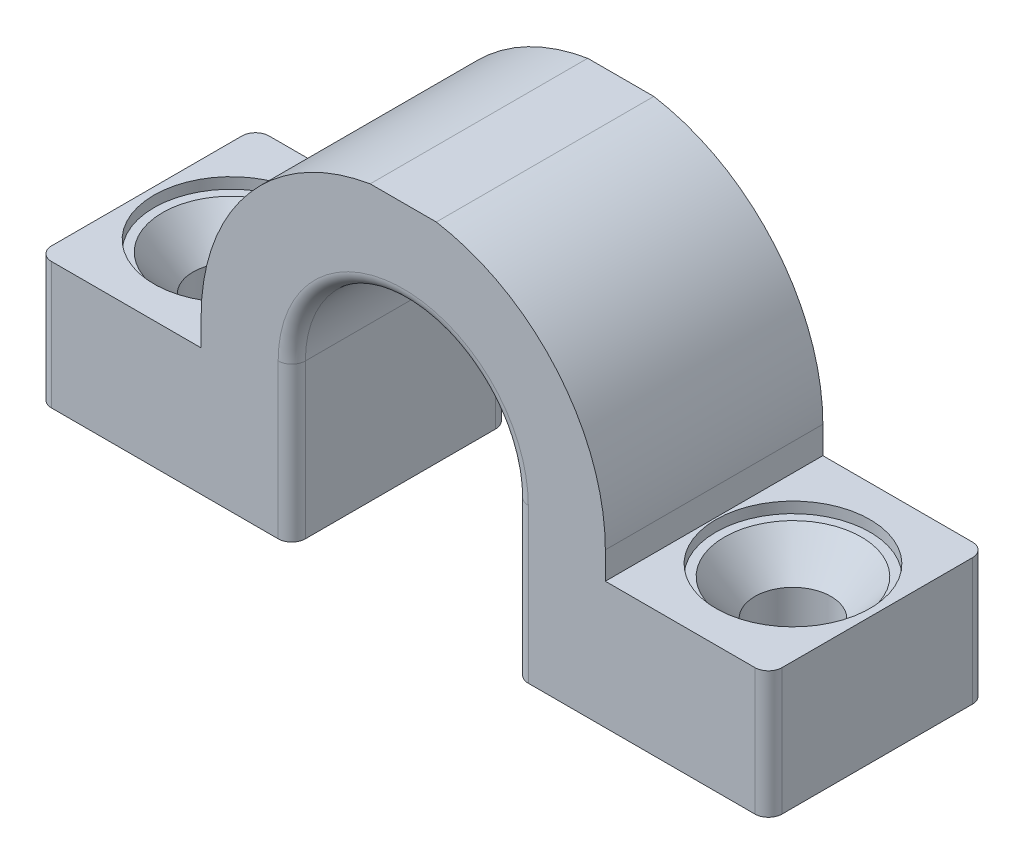
ISO-10303-21;
HEADER;
FILE_DESCRIPTION(('STEP AP214'),'2;1');
FILE_NAME('part.step','',(''),(''),'','','');
FILE_SCHEMA(('AUTOMOTIVE_DESIGN { 1 0 10303 214 1 1 1 1 }'));
ENDSEC;
DATA;
#1=APPLICATION_CONTEXT('core data for automotive mechanical design processes');
#2=APPLICATION_PROTOCOL_DEFINITION('international standard','automotive_design',2000,#1);
#3=PRODUCT_CONTEXT('',#1,'mechanical');
#4=PRODUCT('Part','Part','',(#3));
#5=PRODUCT_RELATED_PRODUCT_CATEGORY('part','',(#4));
#6=PRODUCT_DEFINITION_FORMATION('','',#4);
#7=PRODUCT_DEFINITION_CONTEXT('part definition',#1,'design');
#8=PRODUCT_DEFINITION('design','',#6,#7);
#9=PRODUCT_DEFINITION_SHAPE('','',#8);
#10=(LENGTH_UNIT() NAMED_UNIT(*) SI_UNIT(.MILLI.,.METRE.));
#11=(NAMED_UNIT(*) PLANE_ANGLE_UNIT() SI_UNIT($,.RADIAN.));
#12=(NAMED_UNIT(*) SI_UNIT($,.STERADIAN.) SOLID_ANGLE_UNIT());
#13=UNCERTAINTY_MEASURE_WITH_UNIT(LENGTH_MEASURE(1.E-05),#10,'distance_accuracy_value','');
#14=(GEOMETRIC_REPRESENTATION_CONTEXT(3) GLOBAL_UNCERTAINTY_ASSIGNED_CONTEXT((#13)) GLOBAL_UNIT_ASSIGNED_CONTEXT((#10,
#11,#12)) REPRESENTATION_CONTEXT('',''));
#15=CARTESIAN_POINT('',(0.,0.,0.));
#16=DIRECTION('',(0.,0.,1.));
#17=DIRECTION('',(1.,0.,0.));
#18=AXIS2_PLACEMENT_3D('',#15,#16,#17);
#19=CARTESIAN_POINT('',(15.5,-8.5,6.));
#20=DIRECTION('',(0.,1.,0.));
#21=DIRECTION('',(-1.,0.,0.));
#22=AXIS2_PLACEMENT_3D('',#19,#20,#21);
#23=CYLINDRICAL_SURFACE('',#22,2.1);
#24=CARTESIAN_POINT('',(15.5,-4.10000000000001,6.));
#25=DIRECTION('',(0.,1.,0.));
#26=DIRECTION('',(0.,0.,1.));
#27=AXIS2_PLACEMENT_3D('',#24,#25,#26);
#28=CIRCLE('',#27,2.1);
#29=CARTESIAN_POINT('',(15.5,-4.10000000000001,8.1));
#30=VERTEX_POINT('',#29);
#31=EDGE_CURVE('E352',#30,#30,#28,.T.);
#32=ORIENTED_EDGE('',*,*,#31,.T.);
#33=EDGE_LOOP('',(#32));
#34=FACE_BOUND('',#33,.T.);
#35=CARTESIAN_POINT('',(15.5,-8.5,6.));
#36=DIRECTION('',(0.,1.,0.));
#37=DIRECTION('',(-1.,0.,0.));
#38=AXIS2_PLACEMENT_3D('',#35,#36,#37);
#39=CIRCLE('',#38,2.1);
#40=CARTESIAN_POINT('',(13.4,-8.5,6.));
#41=VERTEX_POINT('',#40);
#42=EDGE_CURVE('E219',#41,#41,#39,.T.);
#43=ORIENTED_EDGE('',*,*,#42,.F.);
#44=EDGE_LOOP('',(#43));
#45=FACE_BOUND('',#44,.T.);
#46=ADVANCED_FACE('F37',(#34,#45),#23,.F.);
#47=CARTESIAN_POINT('',(-15.5,-8.5,6.));
#48=DIRECTION('',(0.,1.,0.));
#49=DIRECTION('',(-1.,0.,0.));
#50=AXIS2_PLACEMENT_3D('',#47,#48,#49);
#51=CYLINDRICAL_SURFACE('',#50,2.1);
#52=CARTESIAN_POINT('',(-15.5,-4.1,6.));
#53=DIRECTION('',(0.,1.,0.));
#54=DIRECTION('',(0.,0.,1.));
#55=AXIS2_PLACEMENT_3D('',#52,#53,#54);
#56=CIRCLE('',#55,2.1);
#57=CARTESIAN_POINT('',(-15.5,-4.1,8.1));
#58=VERTEX_POINT('',#57);
#59=EDGE_CURVE('E11',#58,#58,#56,.T.);
#60=ORIENTED_EDGE('',*,*,#59,.T.);
#61=EDGE_LOOP('',(#60));
#62=FACE_BOUND('',#61,.T.);
#63=CARTESIAN_POINT('',(-15.5,-8.5,6.));
#64=DIRECTION('',(0.,1.,0.));
#65=DIRECTION('',(-1.,0.,0.));
#66=AXIS2_PLACEMENT_3D('',#63,#64,#65);
#67=CIRCLE('',#66,2.1);
#68=CARTESIAN_POINT('',(-17.6,-8.5,6.));
#69=VERTEX_POINT('',#68);
#70=EDGE_CURVE('E216',#69,#69,#67,.T.);
#71=ORIENTED_EDGE('',*,*,#70,.F.);
#72=EDGE_LOOP('',(#71));
#73=FACE_BOUND('',#72,.T.);
#74=ADVANCED_FACE('F370',(#62,#73),#51,.F.);
#75=CARTESIAN_POINT('',(0.,0.,12.));
#76=DIRECTION('',(0.,0.,-1.));
#77=DIRECTION('',(-1.,0.,0.));
#78=AXIS2_PLACEMENT_3D('',#75,#76,#77);
#79=CYLINDRICAL_SURFACE('',#78,11.15);
#80=DIRECTION('',(0.,0.,-1.));
#81=VECTOR('',#80,1.);
#82=CARTESIAN_POINT('',(1.82277261335583,11.,12.));
#83=LINE('',#82,#81);
#84=CARTESIAN_POINT('',(1.82277261335583,11.,12.));
#85=VERTEX_POINT('',#84);
#86=CARTESIAN_POINT('',(1.82277261335583,11.,0.));
#87=VERTEX_POINT('',#86);
#88=EDGE_CURVE('E194',#85,#87,#83,.T.);
#89=ORIENTED_EDGE('',*,*,#88,.F.);
#90=CARTESIAN_POINT('',(0.,0.,12.));
#91=DIRECTION('',(0.,0.,1.));
#92=DIRECTION('',(1.,0.,0.));
#93=AXIS2_PLACEMENT_3D('',#90,#91,#92);
#94=CIRCLE('',#93,11.15);
#95=CARTESIAN_POINT('',(11.15,0.,12.));
#96=VERTEX_POINT('',#95);
#97=EDGE_CURVE('E497',#96,#85,#94,.T.);
#98=ORIENTED_EDGE('',*,*,#97,.F.);
#99=DIRECTION('',(0.,0.,-1.));
#100=VECTOR('',#99,1.);
#101=CARTESIAN_POINT('',(11.15,0.,12.));
#102=LINE('',#101,#100);
#103=CARTESIAN_POINT('',(11.15,0.,0.));
#104=VERTEX_POINT('',#103);
#105=EDGE_CURVE('E238',#96,#104,#102,.T.);
#106=ORIENTED_EDGE('',*,*,#105,.T.);
#107=CARTESIAN_POINT('',(0.,0.,0.));
#108=DIRECTION('',(0.,0.,1.));
#109=DIRECTION('',(1.,0.,0.));
#110=AXIS2_PLACEMENT_3D('',#107,#108,#109);
#111=CIRCLE('',#110,11.15);
#112=EDGE_CURVE('E215',#104,#87,#111,.T.);
#113=ORIENTED_EDGE('',*,*,#112,.T.);
#114=EDGE_LOOP('',(#89,#98,#106,#113));
#115=FACE_BOUND('',#114,.T.);
#116=ADVANCED_FACE('F376',(#115),#79,.T.);
#117=DIRECTION('',(0.,0.,-1.));
#118=VECTOR('',#117,1.);
#119=CARTESIAN_POINT('',(-1.82277261335583,11.,12.));
#120=LINE('',#119,#118);
#121=CARTESIAN_POINT('',(-1.82277261335583,11.,0.));
#122=VERTEX_POINT('',#121);
#123=CARTESIAN_POINT('',(-1.82277261335583,11.,12.));
#124=VERTEX_POINT('',#123);
#125=EDGE_CURVE('E191',#122,#124,#120,.F.);
#126=ORIENTED_EDGE('',*,*,#125,.F.);
#127=CARTESIAN_POINT('',(-11.15,0.,0.));
#128=VERTEX_POINT('',#127);
#129=EDGE_CURVE('E206',#122,#128,#111,.T.);
#130=ORIENTED_EDGE('',*,*,#129,.T.);
#131=DIRECTION('',(0.,0.,-1.));
#132=VECTOR('',#131,1.);
#133=CARTESIAN_POINT('',(-11.15,0.,12.));
#134=LINE('',#133,#132);
#135=CARTESIAN_POINT('',(-11.15,0.,12.));
#136=VERTEX_POINT('',#135);
#137=EDGE_CURVE('E200',#136,#128,#134,.T.);
#138=ORIENTED_EDGE('',*,*,#137,.F.);
#139=EDGE_CURVE('E208',#124,#136,#94,.T.);
#140=ORIENTED_EDGE('',*,*,#139,.F.);
#141=EDGE_LOOP('',(#126,#130,#138,#140));
#142=FACE_BOUND('',#141,.T.);
#143=ADVANCED_FACE('F204',(#142),#79,.T.);
#144=CARTESIAN_POINT('',(0.,0.,12.));
#145=DIRECTION('',(0.,0.,1.));
#146=DIRECTION('',(1.,0.,0.));
#147=AXIS2_PLACEMENT_3D('',#144,#145,#146);
#148=PLANE('',#147);
#149=CARTESIAN_POINT('',(0.,0.,12.));
#150=DIRECTION('',(0.,0.,1.));
#151=DIRECTION('',(1.,0.,0.));
#152=AXIS2_PLACEMENT_3D('',#149,#150,#151);
#153=CIRCLE('',#152,6.9);
#154=CARTESIAN_POINT('',(-6.9,0.,12.));
#155=VERTEX_POINT('',#154);
#156=CARTESIAN_POINT('',(6.9,0.,12.));
#157=VERTEX_POINT('',#156);
#158=EDGE_CURVE('E305',#155,#157,#153,.F.);
#159=ORIENTED_EDGE('',*,*,#158,.T.);
#160=DIRECTION('',(0.,-1.,0.));
#161=VECTOR('',#160,1.);
#162=CARTESIAN_POINT('',(6.9,-8.5,12.));
#163=LINE('',#162,#161);
#164=CARTESIAN_POINT('',(6.9,-8.5,12.));
#165=VERTEX_POINT('',#164);
#166=EDGE_CURVE('E307',#157,#165,#163,.T.);
#167=ORIENTED_EDGE('',*,*,#166,.T.);
#168=DIRECTION('',(1.,0.,0.));
#169=VECTOR('',#168,1.);
#170=CARTESIAN_POINT('',(6.15,-8.5,12.));
#171=LINE('',#170,#169);
#172=CARTESIAN_POINT('',(19.4,-8.5,12.));
#173=VERTEX_POINT('',#172);
#174=EDGE_CURVE('E495',#165,#173,#171,.T.);
#175=ORIENTED_EDGE('',*,*,#174,.T.);
#176=DIRECTION('',(0.,1.,0.));
#177=VECTOR('',#176,1.);
#178=CARTESIAN_POINT('',(19.4,-1.5,12.));
#179=LINE('',#178,#177);
#180=CARTESIAN_POINT('',(19.4,-1.5,12.));
#181=VERTEX_POINT('',#180);
#182=EDGE_CURVE('E300',#173,#181,#179,.T.);
#183=ORIENTED_EDGE('',*,*,#182,.T.);
#184=DIRECTION('',(-1.,0.,0.));
#185=VECTOR('',#184,1.);
#186=CARTESIAN_POINT('',(20.15,-1.5,12.));
#187=LINE('',#186,#185);
#188=CARTESIAN_POINT('',(11.15,-1.5,12.));
#189=VERTEX_POINT('',#188);
#190=EDGE_CURVE('E502',#181,#189,#187,.T.);
#191=ORIENTED_EDGE('',*,*,#190,.T.);
#192=DIRECTION('',(0.,1.,0.));
#193=VECTOR('',#192,1.);
#194=CARTESIAN_POINT('',(11.15,-1.5,12.));
#195=LINE('',#194,#193);
#196=EDGE_CURVE('E223',#189,#96,#195,.T.);
#197=ORIENTED_EDGE('',*,*,#196,.T.);
#198=ORIENTED_EDGE('',*,*,#97,.T.);
#199=DIRECTION('',(-1.,0.,0.));
#200=VECTOR('',#199,1.);
#201=CARTESIAN_POINT('',(0.,11.,12.));
#202=LINE('',#201,#200);
#203=EDGE_CURVE('E512',#85,#124,#202,.T.);
#204=ORIENTED_EDGE('',*,*,#203,.T.);
#205=ORIENTED_EDGE('',*,*,#139,.T.);
#206=DIRECTION('',(0.,-1.,0.));
#207=VECTOR('',#206,1.);
#208=CARTESIAN_POINT('',(-11.15,0.,12.));
#209=LINE('',#208,#207);
#210=CARTESIAN_POINT('',(-11.15,-1.5,12.));
#211=VERTEX_POINT('',#210);
#212=EDGE_CURVE('E491',#136,#211,#209,.T.);
#213=ORIENTED_EDGE('',*,*,#212,.T.);
#214=DIRECTION('',(-1.,0.,0.));
#215=VECTOR('',#214,1.);
#216=CARTESIAN_POINT('',(-11.15,-1.5,12.));
#217=LINE('',#216,#215);
#218=CARTESIAN_POINT('',(-19.4,-1.5,12.));
#219=VERTEX_POINT('',#218);
#220=EDGE_CURVE('E487',#211,#219,#217,.T.);
#221=ORIENTED_EDGE('',*,*,#220,.T.);
#222=DIRECTION('',(0.,-1.,0.));
#223=VECTOR('',#222,1.);
#224=CARTESIAN_POINT('',(-19.4,-8.5,12.));
#225=LINE('',#224,#223);
#226=CARTESIAN_POINT('',(-19.4,-8.5,12.));
#227=VERTEX_POINT('',#226);
#228=EDGE_CURVE('E297',#219,#227,#225,.T.);
#229=ORIENTED_EDGE('',*,*,#228,.T.);
#230=DIRECTION('',(1.,0.,0.));
#231=VECTOR('',#230,1.);
#232=CARTESIAN_POINT('',(-20.15,-8.5,12.));
#233=LINE('',#232,#231);
#234=CARTESIAN_POINT('',(-6.9,-8.5,12.));
#235=VERTEX_POINT('',#234);
#236=EDGE_CURVE('E493',#227,#235,#233,.T.);
#237=ORIENTED_EDGE('',*,*,#236,.T.);
#238=DIRECTION('',(0.,1.,0.));
#239=VECTOR('',#238,1.);
#240=CARTESIAN_POINT('',(-6.9,0.,12.));
#241=LINE('',#240,#239);
#242=EDGE_CURVE('E303',#235,#155,#241,.T.);
#243=ORIENTED_EDGE('',*,*,#242,.T.);
#244=EDGE_LOOP('',(#159,#167,#175,#183,#191,#197,#198,#204,#205,#213,#221,#229,#237,#243));
#245=FACE_BOUND('',#244,.T.);
#246=ADVANCED_FACE('F382',(#245),#148,.T.);
#247=CARTESIAN_POINT('',(0.,0.,0.));
#248=DIRECTION('',(0.,0.,1.));
#249=DIRECTION('',(1.,0.,0.));
#250=AXIS2_PLACEMENT_3D('',#247,#248,#249);
#251=PLANE('',#250);
#252=CARTESIAN_POINT('',(0.,0.,0.));
#253=DIRECTION('',(0.,0.,1.));
#254=DIRECTION('',(1.,0.,0.));
#255=AXIS2_PLACEMENT_3D('',#252,#253,#254);
#256=CIRCLE('',#255,6.9);
#257=CARTESIAN_POINT('',(6.9,0.,0.));
#258=VERTEX_POINT('',#257);
#259=CARTESIAN_POINT('',(-6.9,0.,0.));
#260=VERTEX_POINT('',#259);
#261=EDGE_CURVE('E281',#258,#260,#256,.T.);
#262=ORIENTED_EDGE('',*,*,#261,.T.);
#263=DIRECTION('',(0.,1.,0.));
#264=VECTOR('',#263,1.);
#265=CARTESIAN_POINT('',(-6.9,0.,0.));
#266=LINE('',#265,#264);
#267=CARTESIAN_POINT('',(-6.9,-8.5,0.));
#268=VERTEX_POINT('',#267);
#269=EDGE_CURVE('E283',#260,#268,#266,.F.);
#270=ORIENTED_EDGE('',*,*,#269,.T.);
#271=DIRECTION('',(1.,0.,0.));
#272=VECTOR('',#271,1.);
#273=CARTESIAN_POINT('',(-20.15,-8.5,0.));
#274=LINE('',#273,#272);
#275=CARTESIAN_POINT('',(-19.4,-8.5,0.));
#276=VERTEX_POINT('',#275);
#277=EDGE_CURVE('E228',#276,#268,#274,.T.);
#278=ORIENTED_EDGE('',*,*,#277,.F.);
#279=DIRECTION('',(0.,-1.,0.));
#280=VECTOR('',#279,1.);
#281=CARTESIAN_POINT('',(-19.4,0.,0.));
#282=LINE('',#281,#280);
#283=CARTESIAN_POINT('',(-19.4,-1.5,0.));
#284=VERTEX_POINT('',#283);
#285=EDGE_CURVE('E275',#276,#284,#282,.F.);
#286=ORIENTED_EDGE('',*,*,#285,.T.);
#287=DIRECTION('',(-1.,0.,0.));
#288=VECTOR('',#287,1.);
#289=CARTESIAN_POINT('',(-11.15,-1.5,0.));
#290=LINE('',#289,#288);
#291=CARTESIAN_POINT('',(-11.15,-1.5,0.));
#292=VERTEX_POINT('',#291);
#293=EDGE_CURVE('E226',#292,#284,#290,.T.);
#294=ORIENTED_EDGE('',*,*,#293,.F.);
#295=DIRECTION('',(0.,-1.,0.));
#296=VECTOR('',#295,1.);
#297=CARTESIAN_POINT('',(-11.15,0.,0.));
#298=LINE('',#297,#296);
#299=EDGE_CURVE('E213',#128,#292,#298,.T.);
#300=ORIENTED_EDGE('',*,*,#299,.F.);
#301=ORIENTED_EDGE('',*,*,#129,.F.);
#302=DIRECTION('',(-1.,0.,0.));
#303=VECTOR('',#302,1.);
#304=CARTESIAN_POINT('',(0.,11.,0.));
#305=LINE('',#304,#303);
#306=EDGE_CURVE('E188',#87,#122,#305,.T.);
#307=ORIENTED_EDGE('',*,*,#306,.F.);
#308=ORIENTED_EDGE('',*,*,#112,.F.);
#309=DIRECTION('',(0.,1.,0.));
#310=VECTOR('',#309,1.);
#311=CARTESIAN_POINT('',(11.15,-1.5,0.));
#312=LINE('',#311,#310);
#313=CARTESIAN_POINT('',(11.15,-1.5,0.));
#314=VERTEX_POINT('',#313);
#315=EDGE_CURVE('E236',#314,#104,#312,.T.);
#316=ORIENTED_EDGE('',*,*,#315,.F.);
#317=DIRECTION('',(-1.,0.,0.));
#318=VECTOR('',#317,1.);
#319=CARTESIAN_POINT('',(20.15,-1.5,0.));
#320=LINE('',#319,#318);
#321=CARTESIAN_POINT('',(19.4,-1.5,0.));
#322=VERTEX_POINT('',#321);
#323=EDGE_CURVE('E234',#322,#314,#320,.T.);
#324=ORIENTED_EDGE('',*,*,#323,.F.);
#325=DIRECTION('',(0.,1.,0.));
#326=VECTOR('',#325,1.);
#327=CARTESIAN_POINT('',(19.4,0.,0.));
#328=LINE('',#327,#326);
#329=CARTESIAN_POINT('',(19.4,-8.5,0.));
#330=VERTEX_POINT('',#329);
#331=EDGE_CURVE('E277',#322,#330,#328,.F.);
#332=ORIENTED_EDGE('',*,*,#331,.T.);
#333=DIRECTION('',(1.,0.,0.));
#334=VECTOR('',#333,1.);
#335=CARTESIAN_POINT('',(6.15,-8.5,0.));
#336=LINE('',#335,#334);
#337=CARTESIAN_POINT('',(6.9,-8.5,0.));
#338=VERTEX_POINT('',#337);
#339=EDGE_CURVE('E231',#338,#330,#336,.T.);
#340=ORIENTED_EDGE('',*,*,#339,.F.);
#341=DIRECTION('',(0.,-1.,0.));
#342=VECTOR('',#341,1.);
#343=CARTESIAN_POINT('',(6.9,0.,0.));
#344=LINE('',#343,#342);
#345=EDGE_CURVE('E279',#338,#258,#344,.F.);
#346=ORIENTED_EDGE('',*,*,#345,.T.);
#347=EDGE_LOOP('',(#262,#270,#278,#286,#294,#300,#301,#307,#308,#316,#324,#332,#340,#346));
#348=FACE_BOUND('',#347,.T.);
#349=ADVANCED_FACE('F211',(#348),#251,.F.);
#350=CARTESIAN_POINT('',(-11.15,0.,12.));
#351=DIRECTION('',(1.,0.,0.));
#352=DIRECTION('',(0.,0.,-1.));
#353=AXIS2_PLACEMENT_3D('',#350,#351,#352);
#354=PLANE('',#353);
#355=ORIENTED_EDGE('',*,*,#299,.T.);
#356=DIRECTION('',(0.,0.,-1.));
#357=VECTOR('',#356,1.);
#358=CARTESIAN_POINT('',(-11.15,-1.5,12.));
#359=LINE('',#358,#357);
#360=EDGE_CURVE('E267',#211,#292,#359,.T.);
#361=ORIENTED_EDGE('',*,*,#360,.F.);
#362=ORIENTED_EDGE('',*,*,#212,.F.);
#363=ORIENTED_EDGE('',*,*,#137,.T.);
#364=EDGE_LOOP('',(#355,#361,#362,#363));
#365=FACE_BOUND('',#364,.T.);
#366=ADVANCED_FACE('F388',(#365),#354,.F.);
#367=CARTESIAN_POINT('',(-11.15,-1.5,12.));
#368=DIRECTION('',(0.,-1.,0.));
#369=DIRECTION('',(1.,0.,0.));
#370=AXIS2_PLACEMENT_3D('',#367,#368,#369);
#371=PLANE('',#370);
#372=CARTESIAN_POINT('',(-15.5,-1.5,6.));
#373=DIRECTION('',(0.,1.,0.));
#374=DIRECTION('',(-1.,0.,0.));
#375=AXIS2_PLACEMENT_3D('',#372,#373,#374);
#376=CIRCLE('',#375,4.25);
#377=CARTESIAN_POINT('',(-19.75,-1.5,6.));
#378=VERTEX_POINT('',#377);
#379=EDGE_CURVE('E522',#378,#378,#376,.T.);
#380=ORIENTED_EDGE('',*,*,#379,.F.);
#381=EDGE_LOOP('',(#380));
#382=FACE_BOUND('',#381,.T.);
#383=ORIENTED_EDGE('',*,*,#293,.T.);
#384=CARTESIAN_POINT('',(-19.4,-1.5,0.750000000000001));
#385=DIRECTION('',(0.,-1.,0.));
#386=DIRECTION('',(1.,0.,0.));
#387=AXIS2_PLACEMENT_3D('',#384,#385,#386);
#388=CIRCLE('',#387,0.750000000000001);
#389=CARTESIAN_POINT('',(-20.15,-1.5,0.750000000000001));
#390=VERTEX_POINT('',#389);
#391=EDGE_CURVE('E53',#284,#390,#388,.F.);
#392=ORIENTED_EDGE('',*,*,#391,.T.);
#393=DIRECTION('',(0.,0.,-1.));
#394=VECTOR('',#393,1.);
#395=CARTESIAN_POINT('',(-20.15,-1.5,12.));
#396=LINE('',#395,#394);
#397=CARTESIAN_POINT('',(-20.15,-1.5,11.25));
#398=VERTEX_POINT('',#397);
#399=EDGE_CURVE('E265',#398,#390,#396,.T.);
#400=ORIENTED_EDGE('',*,*,#399,.F.);
#401=CARTESIAN_POINT('',(-19.4,-1.5,11.25));
#402=DIRECTION('',(0.,-1.,0.));
#403=DIRECTION('',(1.,0.,0.));
#404=AXIS2_PLACEMENT_3D('',#401,#402,#403);
#405=CIRCLE('',#404,0.750000000000001);
#406=EDGE_CURVE('E335',#398,#219,#405,.F.);
#407=ORIENTED_EDGE('',*,*,#406,.T.);
#408=ORIENTED_EDGE('',*,*,#220,.F.);
#409=ORIENTED_EDGE('',*,*,#360,.T.);
#410=EDGE_LOOP('',(#383,#392,#400,#407,#408,#409));
#411=FACE_BOUND('',#410,.T.);
#412=ADVANCED_FACE('F424',(#382,#411),#371,.F.);
#413=CARTESIAN_POINT('',(-20.15,-1.5,12.));
#414=DIRECTION('',(1.,0.,0.));
#415=DIRECTION('',(0.,0.,-1.));
#416=AXIS2_PLACEMENT_3D('',#413,#414,#415);
#417=PLANE('',#416);
#418=ORIENTED_EDGE('',*,*,#399,.T.);
#419=DIRECTION('',(0.,-1.,0.));
#420=VECTOR('',#419,1.);
#421=CARTESIAN_POINT('',(-20.15,-1.5,0.750000000000001));
#422=LINE('',#421,#420);
#423=CARTESIAN_POINT('',(-20.15,-8.5,0.750000000000001));
#424=VERTEX_POINT('',#423);
#425=EDGE_CURVE('E332',#390,#424,#422,.T.);
#426=ORIENTED_EDGE('',*,*,#425,.T.);
#427=DIRECTION('',(0.,0.,-1.));
#428=VECTOR('',#427,1.);
#429=CARTESIAN_POINT('',(-20.15,-8.5,12.));
#430=LINE('',#429,#428);
#431=CARTESIAN_POINT('',(-20.15,-8.5,11.25));
#432=VERTEX_POINT('',#431);
#433=EDGE_CURVE('E262',#432,#424,#430,.T.);
#434=ORIENTED_EDGE('',*,*,#433,.F.);
#435=DIRECTION('',(0.,-1.,0.));
#436=VECTOR('',#435,1.);
#437=CARTESIAN_POINT('',(-20.15,-1.5,11.25));
#438=LINE('',#437,#436);
#439=EDGE_CURVE('E60',#432,#398,#438,.F.);
#440=ORIENTED_EDGE('',*,*,#439,.T.);
#441=EDGE_LOOP('',(#418,#426,#434,#440));
#442=FACE_BOUND('',#441,.T.);
#443=ADVANCED_FACE('F420',(#442),#417,.F.);
#444=CARTESIAN_POINT('',(-20.15,-8.5,12.));
#445=DIRECTION('',(0.,1.,0.));
#446=DIRECTION('',(-1.,0.,0.));
#447=AXIS2_PLACEMENT_3D('',#444,#445,#446);
#448=PLANE('',#447);
#449=ORIENTED_EDGE('',*,*,#70,.T.);
#450=EDGE_LOOP('',(#449));
#451=FACE_BOUND('',#450,.T.);
#452=ORIENTED_EDGE('',*,*,#277,.T.);
#453=CARTESIAN_POINT('',(-6.9,-8.5,0.750000000000001));
#454=DIRECTION('',(0.,1.,0.));
#455=DIRECTION('',(-1.,0.,0.));
#456=AXIS2_PLACEMENT_3D('',#453,#454,#455);
#457=CIRCLE('',#456,0.750000000000001);
#458=CARTESIAN_POINT('',(-6.15,-8.5,0.750000000000001));
#459=VERTEX_POINT('',#458);
#460=EDGE_CURVE('E291',#268,#459,#457,.F.);
#461=ORIENTED_EDGE('',*,*,#460,.T.);
#462=DIRECTION('',(0.,0.,-1.));
#463=VECTOR('',#462,1.);
#464=CARTESIAN_POINT('',(-6.15,-8.5,12.));
#465=LINE('',#464,#463);
#466=CARTESIAN_POINT('',(-6.15,-8.5,11.25));
#467=VERTEX_POINT('',#466);
#468=EDGE_CURVE('E259',#467,#459,#465,.T.);
#469=ORIENTED_EDGE('',*,*,#468,.F.);
#470=CARTESIAN_POINT('',(-6.9,-8.5,11.25));
#471=DIRECTION('',(0.,1.,0.));
#472=DIRECTION('',(-1.,0.,0.));
#473=AXIS2_PLACEMENT_3D('',#470,#471,#472);
#474=CIRCLE('',#473,0.750000000000001);
#475=EDGE_CURVE('E289',#467,#235,#474,.F.);
#476=ORIENTED_EDGE('',*,*,#475,.T.);
#477=ORIENTED_EDGE('',*,*,#236,.F.);
#478=CARTESIAN_POINT('',(-19.4,-8.5,11.25));
#479=DIRECTION('',(0.,1.,0.));
#480=DIRECTION('',(-1.,0.,0.));
#481=AXIS2_PLACEMENT_3D('',#478,#479,#480);
#482=CIRCLE('',#481,0.750000000000001);
#483=EDGE_CURVE('E285',#227,#432,#482,.F.);
#484=ORIENTED_EDGE('',*,*,#483,.T.);
#485=ORIENTED_EDGE('',*,*,#433,.T.);
#486=CARTESIAN_POINT('',(-19.4,-8.5,0.750000000000001));
#487=DIRECTION('',(0.,1.,0.));
#488=DIRECTION('',(-1.,0.,0.));
#489=AXIS2_PLACEMENT_3D('',#486,#487,#488);
#490=CIRCLE('',#489,0.750000000000001);
#491=EDGE_CURVE('E287',#424,#276,#490,.F.);
#492=ORIENTED_EDGE('',*,*,#491,.T.);
#493=EDGE_LOOP('',(#452,#461,#469,#476,#477,#484,#485,#492));
#494=FACE_BOUND('',#493,.T.);
#495=ADVANCED_FACE('F416',(#451,#494),#448,.F.);
#496=CARTESIAN_POINT('',(-6.15,-8.5,12.));
#497=DIRECTION('',(-1.,0.,0.));
#498=DIRECTION('',(0.,-1.,0.));
#499=AXIS2_PLACEMENT_3D('',#496,#497,#498);
#500=PLANE('',#499);
#501=ORIENTED_EDGE('',*,*,#468,.T.);
#502=DIRECTION('',(0.,1.,0.));
#503=VECTOR('',#502,1.);
#504=CARTESIAN_POINT('',(-6.15,-8.5,0.750000000000001));
#505=LINE('',#504,#503);
#506=CARTESIAN_POINT('',(-6.15,0.,0.750000000000001));
#507=VERTEX_POINT('',#506);
#508=EDGE_CURVE('E272',#459,#507,#505,.T.);
#509=ORIENTED_EDGE('',*,*,#508,.T.);
#510=DIRECTION('',(0.,0.,-1.));
#511=VECTOR('',#510,1.);
#512=CARTESIAN_POINT('',(-6.15,0.,12.));
#513=LINE('',#512,#511);
#514=CARTESIAN_POINT('',(-6.15,0.,11.25));
#515=VERTEX_POINT('',#514);
#516=EDGE_CURVE('E256',#515,#507,#513,.T.);
#517=ORIENTED_EDGE('',*,*,#516,.F.);
#518=DIRECTION('',(0.,1.,0.));
#519=VECTOR('',#518,1.);
#520=CARTESIAN_POINT('',(-6.15,-8.5,11.25));
#521=LINE('',#520,#519);
#522=EDGE_CURVE('E199',#515,#467,#521,.F.);
#523=ORIENTED_EDGE('',*,*,#522,.T.);
#524=EDGE_LOOP('',(#501,#509,#517,#523));
#525=FACE_BOUND('',#524,.T.);
#526=ADVANCED_FACE('F412',(#525),#500,.F.);
#527=CARTESIAN_POINT('',(0.,0.,12.));
#528=DIRECTION('',(0.,0.,-1.));
#529=DIRECTION('',(-1.,0.,0.));
#530=AXIS2_PLACEMENT_3D('',#527,#528,#529);
#531=CYLINDRICAL_SURFACE('',#530,6.15);
#532=ORIENTED_EDGE('',*,*,#516,.T.);
#533=CARTESIAN_POINT('',(0.,0.,0.750000000000001));
#534=DIRECTION('',(0.,0.,1.));
#535=DIRECTION('',(1.,0.,0.));
#536=AXIS2_PLACEMENT_3D('',#533,#534,#535);
#537=CIRCLE('',#536,6.15);
#538=CARTESIAN_POINT('',(6.15,0.,0.750000000000001));
#539=VERTEX_POINT('',#538);
#540=EDGE_CURVE('E295',#507,#539,#537,.F.);
#541=ORIENTED_EDGE('',*,*,#540,.T.);
#542=DIRECTION('',(0.,0.,-1.));
#543=VECTOR('',#542,1.);
#544=CARTESIAN_POINT('',(6.15,0.,12.));
#545=LINE('',#544,#543);
#546=CARTESIAN_POINT('',(6.15,0.,11.25));
#547=VERTEX_POINT('',#546);
#548=EDGE_CURVE('E253',#547,#539,#545,.T.);
#549=ORIENTED_EDGE('',*,*,#548,.F.);
#550=CARTESIAN_POINT('',(0.,0.,11.25));
#551=DIRECTION('',(0.,0.,1.));
#552=DIRECTION('',(1.,0.,0.));
#553=AXIS2_PLACEMENT_3D('',#550,#551,#552);
#554=CIRCLE('',#553,6.15);
#555=EDGE_CURVE('E293',#547,#515,#554,.T.);
#556=ORIENTED_EDGE('',*,*,#555,.T.);
#557=EDGE_LOOP('',(#532,#541,#549,#556));
#558=FACE_BOUND('',#557,.T.);
#559=ADVANCED_FACE('F408',(#558),#531,.F.);
#560=CARTESIAN_POINT('',(6.15,0.,12.));
#561=DIRECTION('',(1.,0.,0.));
#562=DIRECTION('',(0.,1.,0.));
#563=AXIS2_PLACEMENT_3D('',#560,#561,#562);
#564=PLANE('',#563);
#565=DIRECTION('',(0.,0.,-1.));
#566=VECTOR('',#565,1.);
#567=CARTESIAN_POINT('',(6.15,-8.5,12.));
#568=LINE('',#567,#566);
#569=CARTESIAN_POINT('',(6.15,-8.5,11.25));
#570=VERTEX_POINT('',#569);
#571=CARTESIAN_POINT('',(6.15,-8.5,0.750000000000001));
#572=VERTEX_POINT('',#571);
#573=EDGE_CURVE('E250',#570,#572,#568,.T.);
#574=ORIENTED_EDGE('',*,*,#573,.F.);
#575=DIRECTION('',(0.,-1.,0.));
#576=VECTOR('',#575,1.);
#577=CARTESIAN_POINT('',(6.15,0.,11.25));
#578=LINE('',#577,#576);
#579=EDGE_CURVE('E320',#570,#547,#578,.F.);
#580=ORIENTED_EDGE('',*,*,#579,.T.);
#581=ORIENTED_EDGE('',*,*,#548,.T.);
#582=DIRECTION('',(0.,-1.,0.));
#583=VECTOR('',#582,1.);
#584=CARTESIAN_POINT('',(6.15,0.,0.750000000000001));
#585=LINE('',#584,#583);
#586=EDGE_CURVE('E318',#539,#572,#585,.T.);
#587=ORIENTED_EDGE('',*,*,#586,.T.);
#588=EDGE_LOOP('',(#574,#580,#581,#587));
#589=FACE_BOUND('',#588,.T.);
#590=ADVANCED_FACE('F404',(#589),#564,.F.);
#591=CARTESIAN_POINT('',(6.15,-8.5,12.));
#592=DIRECTION('',(0.,1.,0.));
#593=DIRECTION('',(-1.,0.,0.));
#594=AXIS2_PLACEMENT_3D('',#591,#592,#593);
#595=PLANE('',#594);
#596=ORIENTED_EDGE('',*,*,#42,.T.);
#597=EDGE_LOOP('',(#596));
#598=FACE_BOUND('',#597,.T.);
#599=ORIENTED_EDGE('',*,*,#174,.F.);
#600=CARTESIAN_POINT('',(6.9,-8.5,11.25));
#601=DIRECTION('',(0.,1.,0.));
#602=DIRECTION('',(-1.,0.,0.));
#603=AXIS2_PLACEMENT_3D('',#600,#601,#602);
#604=CIRCLE('',#603,0.750000000000001);
#605=EDGE_CURVE('E316',#165,#570,#604,.F.);
#606=ORIENTED_EDGE('',*,*,#605,.T.);
#607=ORIENTED_EDGE('',*,*,#573,.T.);
#608=CARTESIAN_POINT('',(6.9,-8.5,0.750000000000001));
#609=DIRECTION('',(0.,1.,0.));
#610=DIRECTION('',(-1.,0.,0.));
#611=AXIS2_PLACEMENT_3D('',#608,#609,#610);
#612=CIRCLE('',#611,0.750000000000001);
#613=EDGE_CURVE('E314',#572,#338,#612,.F.);
#614=ORIENTED_EDGE('',*,*,#613,.T.);
#615=ORIENTED_EDGE('',*,*,#339,.T.);
#616=CARTESIAN_POINT('',(19.4,-8.5,0.750000000000001));
#617=DIRECTION('',(0.,1.,0.));
#618=DIRECTION('',(-1.,0.,0.));
#619=AXIS2_PLACEMENT_3D('',#616,#617,#618);
#620=CIRCLE('',#619,0.750000000000001);
#621=CARTESIAN_POINT('',(20.15,-8.5,0.750000000000001));
#622=VERTEX_POINT('',#621);
#623=EDGE_CURVE('E312',#330,#622,#620,.F.);
#624=ORIENTED_EDGE('',*,*,#623,.T.);
#625=DIRECTION('',(0.,0.,-1.));
#626=VECTOR('',#625,1.);
#627=CARTESIAN_POINT('',(20.15,-8.5,12.));
#628=LINE('',#627,#626);
#629=CARTESIAN_POINT('',(20.15,-8.5,11.25));
#630=VERTEX_POINT('',#629);
#631=EDGE_CURVE('E247',#630,#622,#628,.T.);
#632=ORIENTED_EDGE('',*,*,#631,.F.);
#633=CARTESIAN_POINT('',(19.4,-8.5,11.25));
#634=DIRECTION('',(0.,1.,0.));
#635=DIRECTION('',(-1.,0.,0.));
#636=AXIS2_PLACEMENT_3D('',#633,#634,#635);
#637=CIRCLE('',#636,0.750000000000001);
#638=EDGE_CURVE('E310',#630,#173,#637,.F.);
#639=ORIENTED_EDGE('',*,*,#638,.T.);
#640=EDGE_LOOP('',(#599,#606,#607,#614,#615,#624,#632,#639));
#641=FACE_BOUND('',#640,.T.);
#642=ADVANCED_FACE('F400',(#598,#641),#595,.F.);
#643=CARTESIAN_POINT('',(20.15,-8.5,12.));
#644=DIRECTION('',(-1.,0.,0.));
#645=DIRECTION('',(0.,0.,1.));
#646=AXIS2_PLACEMENT_3D('',#643,#644,#645);
#647=PLANE('',#646);
#648=ORIENTED_EDGE('',*,*,#631,.T.);
#649=DIRECTION('',(0.,1.,0.));
#650=VECTOR('',#649,1.);
#651=CARTESIAN_POINT('',(20.15,-8.5,0.750000000000001));
#652=LINE('',#651,#650);
#653=CARTESIAN_POINT('',(20.15,-1.5,0.750000000000001));
#654=VERTEX_POINT('',#653);
#655=EDGE_CURVE('E324',#622,#654,#652,.T.);
#656=ORIENTED_EDGE('',*,*,#655,.T.);
#657=DIRECTION('',(0.,0.,-1.));
#658=VECTOR('',#657,1.);
#659=CARTESIAN_POINT('',(20.15,-1.5,12.));
#660=LINE('',#659,#658);
#661=CARTESIAN_POINT('',(20.15,-1.5,11.25));
#662=VERTEX_POINT('',#661);
#663=EDGE_CURVE('E244',#662,#654,#660,.T.);
#664=ORIENTED_EDGE('',*,*,#663,.F.);
#665=DIRECTION('',(0.,1.,0.));
#666=VECTOR('',#665,1.);
#667=CARTESIAN_POINT('',(20.15,-8.5,11.25));
#668=LINE('',#667,#666);
#669=EDGE_CURVE('E322',#662,#630,#668,.F.);
#670=ORIENTED_EDGE('',*,*,#669,.T.);
#671=EDGE_LOOP('',(#648,#656,#664,#670));
#672=FACE_BOUND('',#671,.T.);
#673=ADVANCED_FACE('F396',(#672),#647,.F.);
#674=CARTESIAN_POINT('',(20.15,-1.5,12.));
#675=DIRECTION('',(0.,-1.,0.));
#676=DIRECTION('',(1.,0.,0.));
#677=AXIS2_PLACEMENT_3D('',#674,#675,#676);
#678=PLANE('',#677);
#679=CARTESIAN_POINT('',(15.5,-1.5,6.));
#680=DIRECTION('',(0.,1.,0.));
#681=DIRECTION('',(-1.,0.,0.));
#682=AXIS2_PLACEMENT_3D('',#679,#680,#681);
#683=CIRCLE('',#682,4.25000000000001);
#684=CARTESIAN_POINT('',(11.25,-1.5,6.));
#685=VERTEX_POINT('',#684);
#686=EDGE_CURVE('E516',#685,#685,#683,.T.);
#687=ORIENTED_EDGE('',*,*,#686,.F.);
#688=EDGE_LOOP('',(#687));
#689=FACE_BOUND('',#688,.T.);
#690=ORIENTED_EDGE('',*,*,#663,.T.);
#691=CARTESIAN_POINT('',(19.4,-1.5,0.750000000000001));
#692=DIRECTION('',(0.,-1.,0.));
#693=DIRECTION('',(1.,0.,0.));
#694=AXIS2_PLACEMENT_3D('',#691,#692,#693);
#695=CIRCLE('',#694,0.750000000000001);
#696=EDGE_CURVE('E329',#654,#322,#695,.F.);
#697=ORIENTED_EDGE('',*,*,#696,.T.);
#698=ORIENTED_EDGE('',*,*,#323,.T.);
#699=DIRECTION('',(0.,0.,-1.));
#700=VECTOR('',#699,1.);
#701=CARTESIAN_POINT('',(11.15,-1.5,12.));
#702=LINE('',#701,#700);
#703=EDGE_CURVE('E241',#189,#314,#702,.T.);
#704=ORIENTED_EDGE('',*,*,#703,.F.);
#705=ORIENTED_EDGE('',*,*,#190,.F.);
#706=CARTESIAN_POINT('',(19.4,-1.5,11.25));
#707=DIRECTION('',(0.,-1.,0.));
#708=DIRECTION('',(1.,0.,0.));
#709=AXIS2_PLACEMENT_3D('',#706,#707,#708);
#710=CIRCLE('',#709,0.750000000000001);
#711=EDGE_CURVE('E327',#181,#662,#710,.F.);
#712=ORIENTED_EDGE('',*,*,#711,.T.);
#713=EDGE_LOOP('',(#690,#697,#698,#704,#705,#712));
#714=FACE_BOUND('',#713,.T.);
#715=ADVANCED_FACE('F392',(#689,#714),#678,.F.);
#716=CARTESIAN_POINT('',(11.15,-1.5,12.));
#717=DIRECTION('',(-1.,0.,0.));
#718=DIRECTION('',(0.,0.,1.));
#719=AXIS2_PLACEMENT_3D('',#716,#717,#718);
#720=PLANE('',#719);
#721=ORIENTED_EDGE('',*,*,#315,.T.);
#722=ORIENTED_EDGE('',*,*,#105,.F.);
#723=ORIENTED_EDGE('',*,*,#196,.F.);
#724=ORIENTED_EDGE('',*,*,#703,.T.);
#725=EDGE_LOOP('',(#721,#722,#723,#724));
#726=FACE_BOUND('',#725,.T.);
#727=ADVANCED_FACE('F389',(#726),#720,.F.);
#728=CARTESIAN_POINT('',(0.,11.,0.));
#729=DIRECTION('',(0.,1.,0.));
#730=DIRECTION('',(0.,0.,1.));
#731=AXIS2_PLACEMENT_3D('',#728,#729,#730);
#732=PLANE('',#731);
#733=ORIENTED_EDGE('',*,*,#88,.T.);
#734=ORIENTED_EDGE('',*,*,#306,.T.);
#735=ORIENTED_EDGE('',*,*,#125,.T.);
#736=ORIENTED_EDGE('',*,*,#203,.F.);
#737=EDGE_LOOP('',(#733,#734,#735,#736));
#738=FACE_BOUND('',#737,.T.);
#739=ADVANCED_FACE('F190',(#738),#732,.T.);
#740=CARTESIAN_POINT('',(6.9,0.,0.750000000000001));
#741=DIRECTION('',(0.,-1.,0.));
#742=DIRECTION('',(1.,0.,0.));
#743=AXIS2_PLACEMENT_3D('',#740,#741,#742);
#744=CYLINDRICAL_SURFACE('',#743,0.750000000000001);
#745=ORIENTED_EDGE('',*,*,#613,.F.);
#746=ORIENTED_EDGE('',*,*,#586,.F.);
#747=CARTESIAN_POINT('',(6.9,0.,0.750000000000001));
#748=DIRECTION('',(0.,1.,0.));
#749=DIRECTION('',(0.,0.,1.));
#750=AXIS2_PLACEMENT_3D('',#747,#748,#749);
#751=CIRCLE('',#750,0.750000000000001);
#752=EDGE_CURVE('E209',#258,#539,#751,.T.);
#753=ORIENTED_EDGE('',*,*,#752,.F.);
#754=ORIENTED_EDGE('',*,*,#345,.F.);
#755=EDGE_LOOP('',(#745,#746,#753,#754));
#756=FACE_BOUND('',#755,.T.);
#757=ADVANCED_FACE('F442',(#756),#744,.T.);
#758=CARTESIAN_POINT('',(0.,0.,0.750000000000001));
#759=DIRECTION('',(0.,0.,1.));
#760=DIRECTION('',(1.,0.,0.));
#761=AXIS2_PLACEMENT_3D('',#758,#759,#760);
#762=TOROIDAL_SURFACE('',#761,6.9,0.750000000000001);
#763=ORIENTED_EDGE('',*,*,#752,.T.);
#764=ORIENTED_EDGE('',*,*,#540,.F.);
#765=CARTESIAN_POINT('',(-6.9,0.,0.750000000000001));
#766=DIRECTION('',(0.,-1.,0.));
#767=DIRECTION('',(1.,0.,0.));
#768=AXIS2_PLACEMENT_3D('',#765,#766,#767);
#769=CIRCLE('',#768,0.750000000000001);
#770=EDGE_CURVE('E339',#260,#507,#769,.T.);
#771=ORIENTED_EDGE('',*,*,#770,.F.);
#772=ORIENTED_EDGE('',*,*,#261,.F.);
#773=EDGE_LOOP('',(#763,#764,#771,#772));
#774=FACE_BOUND('',#773,.T.);
#775=ADVANCED_FACE('F438',(#774),#762,.T.);
#776=CARTESIAN_POINT('',(-6.9,-8.5,0.750000000000001));
#777=DIRECTION('',(0.,1.,0.));
#778=DIRECTION('',(-1.,0.,0.));
#779=AXIS2_PLACEMENT_3D('',#776,#777,#778);
#780=CYLINDRICAL_SURFACE('',#779,0.750000000000001);
#781=ORIENTED_EDGE('',*,*,#460,.F.);
#782=ORIENTED_EDGE('',*,*,#269,.F.);
#783=ORIENTED_EDGE('',*,*,#770,.T.);
#784=ORIENTED_EDGE('',*,*,#508,.F.);
#785=EDGE_LOOP('',(#781,#782,#783,#784));
#786=FACE_BOUND('',#785,.T.);
#787=ADVANCED_FACE('F434',(#786),#780,.T.);
#788=CARTESIAN_POINT('',(-6.9,0.,11.25));
#789=DIRECTION('',(0.,-1.,0.));
#790=DIRECTION('',(1.,0.,0.));
#791=AXIS2_PLACEMENT_3D('',#788,#789,#790);
#792=CYLINDRICAL_SURFACE('',#791,0.750000000000001);
#793=ORIENTED_EDGE('',*,*,#475,.F.);
#794=ORIENTED_EDGE('',*,*,#522,.F.);
#795=CARTESIAN_POINT('',(-6.9,0.,11.25));
#796=DIRECTION('',(0.,1.,0.));
#797=DIRECTION('',(0.,0.,1.));
#798=AXIS2_PLACEMENT_3D('',#795,#796,#797);
#799=CIRCLE('',#798,0.750000000000001);
#800=EDGE_CURVE('E341',#155,#515,#799,.T.);
#801=ORIENTED_EDGE('',*,*,#800,.F.);
#802=ORIENTED_EDGE('',*,*,#242,.F.);
#803=EDGE_LOOP('',(#793,#794,#801,#802));
#804=FACE_BOUND('',#803,.T.);
#805=ADVANCED_FACE('F437',(#804),#792,.T.);
#806=CARTESIAN_POINT('',(0.,0.,11.25));
#807=DIRECTION('',(0.,0.,1.));
#808=DIRECTION('',(1.,0.,0.));
#809=AXIS2_PLACEMENT_3D('',#806,#807,#808);
#810=TOROIDAL_SURFACE('',#809,6.9,0.750000000000001);
#811=ORIENTED_EDGE('',*,*,#800,.T.);
#812=ORIENTED_EDGE('',*,*,#555,.F.);
#813=CARTESIAN_POINT('',(6.9,0.,11.25));
#814=DIRECTION('',(0.,-1.,0.));
#815=DIRECTION('',(1.,0.,0.));
#816=AXIS2_PLACEMENT_3D('',#813,#814,#815);
#817=CIRCLE('',#816,0.750000000000001);
#818=EDGE_CURVE('E344',#157,#547,#817,.T.);
#819=ORIENTED_EDGE('',*,*,#818,.F.);
#820=ORIENTED_EDGE('',*,*,#158,.F.);
#821=EDGE_LOOP('',(#811,#812,#819,#820));
#822=FACE_BOUND('',#821,.T.);
#823=ADVANCED_FACE('F451',(#822),#810,.T.);
#824=CARTESIAN_POINT('',(6.9,0.,11.25));
#825=DIRECTION('',(0.,1.,0.));
#826=DIRECTION('',(-1.,0.,0.));
#827=AXIS2_PLACEMENT_3D('',#824,#825,#826);
#828=CYLINDRICAL_SURFACE('',#827,0.750000000000001);
#829=ORIENTED_EDGE('',*,*,#818,.T.);
#830=ORIENTED_EDGE('',*,*,#579,.F.);
#831=ORIENTED_EDGE('',*,*,#605,.F.);
#832=ORIENTED_EDGE('',*,*,#166,.F.);
#833=EDGE_LOOP('',(#829,#830,#831,#832));
#834=FACE_BOUND('',#833,.T.);
#835=ADVANCED_FACE('F447',(#834),#828,.T.);
#836=CARTESIAN_POINT('',(19.4,-8.5,0.750000000000001));
#837=DIRECTION('',(0.,1.,0.));
#838=DIRECTION('',(0.,0.,1.));
#839=AXIS2_PLACEMENT_3D('',#836,#837,#838);
#840=CYLINDRICAL_SURFACE('',#839,0.750000000000001);
#841=ORIENTED_EDGE('',*,*,#623,.F.);
#842=ORIENTED_EDGE('',*,*,#331,.F.);
#843=ORIENTED_EDGE('',*,*,#696,.F.);
#844=ORIENTED_EDGE('',*,*,#655,.F.);
#845=EDGE_LOOP('',(#841,#842,#843,#844));
#846=FACE_BOUND('',#845,.T.);
#847=ADVANCED_FACE('F450',(#846),#840,.T.);
#848=CARTESIAN_POINT('',(19.4,0.,11.25));
#849=DIRECTION('',(0.,-1.,0.));
#850=DIRECTION('',(0.,0.,-1.));
#851=AXIS2_PLACEMENT_3D('',#848,#849,#850);
#852=CYLINDRICAL_SURFACE('',#851,0.750000000000001);
#853=ORIENTED_EDGE('',*,*,#638,.F.);
#854=ORIENTED_EDGE('',*,*,#669,.F.);
#855=ORIENTED_EDGE('',*,*,#711,.F.);
#856=ORIENTED_EDGE('',*,*,#182,.F.);
#857=EDGE_LOOP('',(#853,#854,#855,#856));
#858=FACE_BOUND('',#857,.T.);
#859=ADVANCED_FACE('F461',(#858),#852,.T.);
#860=CARTESIAN_POINT('',(-19.4,-1.5,0.750000000000001));
#861=DIRECTION('',(0.,-1.,0.));
#862=DIRECTION('',(0.,0.,-1.));
#863=AXIS2_PLACEMENT_3D('',#860,#861,#862);
#864=CYLINDRICAL_SURFACE('',#863,0.750000000000001);
#865=ORIENTED_EDGE('',*,*,#391,.F.);
#866=ORIENTED_EDGE('',*,*,#285,.F.);
#867=ORIENTED_EDGE('',*,*,#491,.F.);
#868=ORIENTED_EDGE('',*,*,#425,.F.);
#869=EDGE_LOOP('',(#865,#866,#867,#868));
#870=FACE_BOUND('',#869,.T.);
#871=ADVANCED_FACE('F465',(#870),#864,.T.);
#872=CARTESIAN_POINT('',(-19.4,0.,11.25));
#873=DIRECTION('',(0.,1.,0.));
#874=DIRECTION('',(0.,0.,1.));
#875=AXIS2_PLACEMENT_3D('',#872,#873,#874);
#876=CYLINDRICAL_SURFACE('',#875,0.750000000000001);
#877=ORIENTED_EDGE('',*,*,#406,.F.);
#878=ORIENTED_EDGE('',*,*,#439,.F.);
#879=ORIENTED_EDGE('',*,*,#483,.F.);
#880=ORIENTED_EDGE('',*,*,#228,.F.);
#881=EDGE_LOOP('',(#877,#878,#879,#880));
#882=FACE_BOUND('',#881,.T.);
#883=ADVANCED_FACE('F469',(#882),#876,.T.);
#884=CARTESIAN_POINT('',(-15.5,-2.1,6.));
#885=DIRECTION('',(0.,1.,0.));
#886=DIRECTION('',(-1.,0.,0.));
#887=AXIS2_PLACEMENT_3D('',#884,#885,#886);
#888=PLANE('',#887);
#889=CARTESIAN_POINT('',(-15.5,-2.1,6.));
#890=DIRECTION('',(0.,1.,0.));
#891=DIRECTION('',(-1.,0.,0.));
#892=AXIS2_PLACEMENT_3D('',#889,#890,#891);
#893=CIRCLE('',#892,3.77819926235455);
#894=CARTESIAN_POINT('',(-19.2781992623546,-2.1,6.));
#895=VERTEX_POINT('',#894);
#896=EDGE_CURVE('E46',#895,#895,#893,.F.);
#897=ORIENTED_EDGE('',*,*,#896,.T.);
#898=EDGE_LOOP('',(#897));
#899=FACE_BOUND('',#898,.T.);
#900=CARTESIAN_POINT('',(-15.5,-2.1,6.));
#901=DIRECTION('',(0.,1.,0.));
#902=DIRECTION('',(-1.,0.,0.));
#903=AXIS2_PLACEMENT_3D('',#900,#901,#902);
#904=CIRCLE('',#903,4.25);
#905=CARTESIAN_POINT('',(-19.75,-2.1,6.));
#906=VERTEX_POINT('',#905);
#907=EDGE_CURVE('E347',#906,#906,#904,.T.);
#908=ORIENTED_EDGE('',*,*,#907,.T.);
#909=EDGE_LOOP('',(#908));
#910=FACE_BOUND('',#909,.T.);
#911=ADVANCED_FACE('F357',(#899,#910),#888,.T.);
#912=CARTESIAN_POINT('',(-15.5,-2.1,6.));
#913=DIRECTION('',(0.,1.,0.));
#914=DIRECTION('',(-1.,0.,0.));
#915=AXIS2_PLACEMENT_3D('',#912,#913,#914);
#916=CYLINDRICAL_SURFACE('',#915,4.25);
#917=ORIENTED_EDGE('',*,*,#907,.F.);
#918=EDGE_LOOP('',(#917));
#919=FACE_BOUND('',#918,.T.);
#920=ORIENTED_EDGE('',*,*,#379,.T.);
#921=EDGE_LOOP('',(#920));
#922=FACE_BOUND('',#921,.T.);
#923=ADVANCED_FACE('F481',(#919,#922),#916,.F.);
#924=CARTESIAN_POINT('',(15.5,-2.1,6.));
#925=DIRECTION('',(0.,1.,0.));
#926=DIRECTION('',(-1.,0.,0.));
#927=AXIS2_PLACEMENT_3D('',#924,#925,#926);
#928=PLANE('',#927);
#929=CARTESIAN_POINT('',(15.5,-2.1,6.));
#930=DIRECTION('',(0.,1.,0.));
#931=DIRECTION('',(-1.,0.,0.));
#932=AXIS2_PLACEMENT_3D('',#929,#930,#931);
#933=CIRCLE('',#932,3.77819926235456);
#934=CARTESIAN_POINT('',(11.7218007376454,-2.1,6.));
#935=VERTEX_POINT('',#934);
#936=EDGE_CURVE('E338',#935,#935,#933,.F.);
#937=ORIENTED_EDGE('',*,*,#936,.T.);
#938=EDGE_LOOP('',(#937));
#939=FACE_BOUND('',#938,.T.);
#940=CARTESIAN_POINT('',(15.5,-2.1,6.));
#941=DIRECTION('',(0.,1.,0.));
#942=DIRECTION('',(-1.,0.,0.));
#943=AXIS2_PLACEMENT_3D('',#940,#941,#942);
#944=CIRCLE('',#943,4.25000000000001);
#945=CARTESIAN_POINT('',(11.25,-2.1,6.));
#946=VERTEX_POINT('',#945);
#947=EDGE_CURVE('E519',#946,#946,#944,.T.);
#948=ORIENTED_EDGE('',*,*,#947,.T.);
#949=EDGE_LOOP('',(#948));
#950=FACE_BOUND('',#949,.T.);
#951=ADVANCED_FACE('F530',(#939,#950),#928,.T.);
#952=CARTESIAN_POINT('',(15.5,-2.1,6.));
#953=DIRECTION('',(0.,1.,0.));
#954=DIRECTION('',(-1.,0.,0.));
#955=AXIS2_PLACEMENT_3D('',#952,#953,#954);
#956=CYLINDRICAL_SURFACE('',#955,4.25000000000001);
#957=ORIENTED_EDGE('',*,*,#947,.F.);
#958=EDGE_LOOP('',(#957));
#959=FACE_BOUND('',#958,.T.);
#960=ORIENTED_EDGE('',*,*,#686,.T.);
#961=EDGE_LOOP('',(#960));
#962=FACE_BOUND('',#961,.T.);
#963=ADVANCED_FACE('F366',(#959,#962),#956,.F.);
#964=CARTESIAN_POINT('',(15.5,-2.1,6.));
#965=DIRECTION('',(0.,1.,0.));
#966=DIRECTION('',(0.,0.,1.));
#967=AXIS2_PLACEMENT_3D('',#964,#965,#966);
#968=CONICAL_SURFACE('',#967,3.77819926235457,0.69813170079773);
#969=ORIENTED_EDGE('',*,*,#31,.F.);
#970=EDGE_LOOP('',(#969));
#971=FACE_BOUND('',#970,.T.);
#972=ORIENTED_EDGE('',*,*,#936,.F.);
#973=EDGE_LOOP('',(#972));
#974=FACE_BOUND('',#973,.T.);
#975=ADVANCED_FACE('F361',(#971,#974),#968,.F.);
#976=CARTESIAN_POINT('',(-15.5,-2.1,6.));
#977=DIRECTION('',(0.,1.,0.));
#978=DIRECTION('',(0.,0.,1.));
#979=AXIS2_PLACEMENT_3D('',#976,#977,#978);
#980=CONICAL_SURFACE('',#979,3.77819926235455,0.69813170079773);
#981=ORIENTED_EDGE('',*,*,#59,.F.);
#982=EDGE_LOOP('',(#981));
#983=FACE_BOUND('',#982,.T.);
#984=ORIENTED_EDGE('',*,*,#896,.F.);
#985=EDGE_LOOP('',(#984));
#986=FACE_BOUND('',#985,.T.);
#987=ADVANCED_FACE('F40',(#983,#986),#980,.F.);
#988=CLOSED_SHELL('',(#46,#74,#116,#143,#246,#349,#366,#412,#443,#495,#526,#559,#590,#642,#673,
#715,#727,#739,#757,#775,#787,#805,#823,#835,#847,#859,#871,#883,#911,#923,#951,#963,#975,#987));
#989=MANIFOLD_SOLID_BREP('B2',#988);
#990=ADVANCED_BREP_SHAPE_REPRESENTATION('',(#18,#989),#14);
#991=SHAPE_DEFINITION_REPRESENTATION(#9,#990);
ENDSEC;
END-ISO-10303-21;
